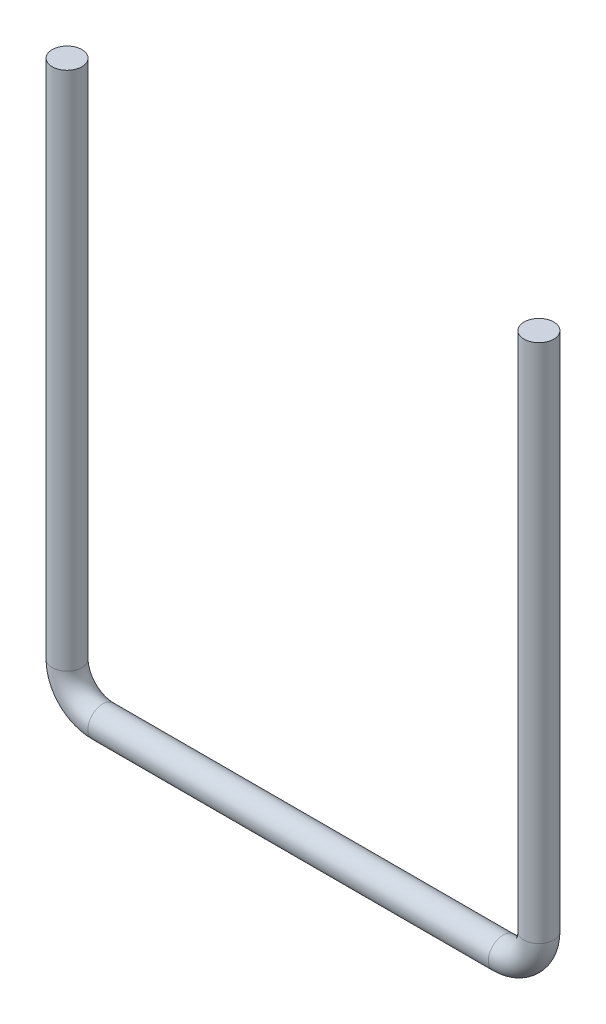
ISO-10303-21;
HEADER;
FILE_DESCRIPTION(('STEP AP214'),'2;1');
FILE_NAME('part.step','',(''),(''),'','','');
FILE_SCHEMA(('AUTOMOTIVE_DESIGN { 1 0 10303 214 1 1 1 1 }'));
ENDSEC;
DATA;
#1=APPLICATION_CONTEXT('core data for automotive mechanical design processes');
#2=APPLICATION_PROTOCOL_DEFINITION('international standard','automotive_design',2000,#1);
#3=PRODUCT_CONTEXT('',#1,'mechanical');
#4=PRODUCT('Part','Part','',(#3));
#5=PRODUCT_RELATED_PRODUCT_CATEGORY('part','',(#4));
#6=PRODUCT_DEFINITION_FORMATION('','',#4);
#7=PRODUCT_DEFINITION_CONTEXT('part definition',#1,'design');
#8=PRODUCT_DEFINITION('design','',#6,#7);
#9=PRODUCT_DEFINITION_SHAPE('','',#8);
#10=(LENGTH_UNIT() NAMED_UNIT(*) SI_UNIT(.MILLI.,.METRE.));
#11=(NAMED_UNIT(*) PLANE_ANGLE_UNIT() SI_UNIT($,.RADIAN.));
#12=(NAMED_UNIT(*) SI_UNIT($,.STERADIAN.) SOLID_ANGLE_UNIT());
#13=UNCERTAINTY_MEASURE_WITH_UNIT(LENGTH_MEASURE(1.E-05),#10,'distance_accuracy_value','');
#14=(GEOMETRIC_REPRESENTATION_CONTEXT(3) GLOBAL_UNCERTAINTY_ASSIGNED_CONTEXT((#13)) GLOBAL_UNIT_ASSIGNED_CONTEXT((#10,
#11,#12)) REPRESENTATION_CONTEXT('',''));
#15=CARTESIAN_POINT('',(0.,0.,0.));
#16=DIRECTION('',(0.,0.,1.));
#17=DIRECTION('',(1.,0.,0.));
#18=AXIS2_PLACEMENT_3D('',#15,#16,#17);
#19=CARTESIAN_POINT('',(0.,0.,0.));
#20=DIRECTION('',(0.,1.,0.));
#21=DIRECTION('',(0.,0.,1.));
#22=AXIS2_PLACEMENT_3D('',#19,#20,#21);
#23=PLANE('',#22);
#24=CARTESIAN_POINT('',(0.,0.,0.));
#25=DIRECTION('',(0.,1.,0.));
#26=DIRECTION('',(0.,0.,1.));
#27=AXIS2_PLACEMENT_3D('',#24,#25,#26);
#28=CIRCLE('',#27,1.04);
#29=CARTESIAN_POINT('',(0.,0.,1.04));
#30=VERTEX_POINT('',#29);
#31=EDGE_CURVE('E70',#30,#30,#28,.T.);
#32=ORIENTED_EDGE('',*,*,#31,.T.);
#33=EDGE_LOOP('',(#32));
#34=FACE_BOUND('',#33,.T.);
#35=ADVANCED_FACE('F43',(#34),#23,.T.);
#36=CARTESIAN_POINT('',(33.,0.,0.));
#37=DIRECTION('',(0.,-1.,0.));
#38=DIRECTION('',(0.,0.,1.));
#39=AXIS2_PLACEMENT_3D('',#36,#37,#38);
#40=PLANE('',#39);
#41=CARTESIAN_POINT('',(33.,0.,0.));
#42=DIRECTION('',(0.,-1.,0.));
#43=DIRECTION('',(0.,0.,1.));
#44=AXIS2_PLACEMENT_3D('',#41,#42,#43);
#45=CIRCLE('',#44,1.04);
#46=CARTESIAN_POINT('',(33.,0.,1.04));
#47=VERTEX_POINT('',#46);
#48=EDGE_CURVE('E10',#47,#47,#45,.T.);
#49=ORIENTED_EDGE('',*,*,#48,.F.);
#50=EDGE_LOOP('',(#49));
#51=FACE_BOUND('',#50,.T.);
#52=ADVANCED_FACE('F79',(#51),#40,.F.);
#53=CARTESIAN_POINT('',(0.,0.,0.));
#54=DIRECTION('',(0.,-1.,0.));
#55=DIRECTION('',(1.,0.,0.));
#56=AXIS2_PLACEMENT_3D('',#53,#54,#55);
#57=CYLINDRICAL_SURFACE('',#56,1.04);
#58=CARTESIAN_POINT('',(0.,-36.4,0.));
#59=DIRECTION('',(0.,1.,0.));
#60=DIRECTION('',(0.,0.,1.));
#61=AXIS2_PLACEMENT_3D('',#58,#59,#60);
#62=CIRCLE('',#61,1.04);
#63=CARTESIAN_POINT('',(-1.04,-36.4,0.));
#64=VERTEX_POINT('',#63);
#65=EDGE_CURVE('E66',#64,#64,#62,.T.);
#66=ORIENTED_EDGE('',*,*,#65,.T.);
#67=EDGE_LOOP('',(#66));
#68=FACE_BOUND('',#67,.T.);
#69=ORIENTED_EDGE('',*,*,#31,.F.);
#70=EDGE_LOOP('',(#69));
#71=FACE_BOUND('',#70,.T.);
#72=ADVANCED_FACE('F76',(#68,#71),#57,.T.);
#73=CARTESIAN_POINT('',(2.5,-36.4,0.));
#74=DIRECTION('',(0.,0.,1.));
#75=DIRECTION('',(1.,0.,0.));
#76=AXIS2_PLACEMENT_3D('',#73,#74,#75);
#77=TOROIDAL_SURFACE('',#76,2.5,1.04);
#78=CARTESIAN_POINT('',(2.5,-38.9,0.));
#79=DIRECTION('',(-1.,0.,0.));
#80=DIRECTION('',(0.,0.,1.));
#81=AXIS2_PLACEMENT_3D('',#78,#79,#80);
#82=CIRCLE('',#81,1.04);
#83=CARTESIAN_POINT('',(2.5,-39.94,0.));
#84=VERTEX_POINT('',#83);
#85=EDGE_CURVE('E60',#84,#84,#82,.T.);
#86=CARTESIAN_POINT('',(2.5,-36.4,0.));
#87=DIRECTION('',(0.,0.,1.));
#88=DIRECTION('',(1.,0.,0.));
#89=AXIS2_PLACEMENT_3D('',#86,#87,#88);
#90=CIRCLE('',#89,3.54);
#91=EDGE_CURVE('',#64,#84,#90,.T.);
#92=ORIENTED_EDGE('',*,*,#65,.F.);
#93=ORIENTED_EDGE('',*,*,#85,.T.);
#94=ORIENTED_EDGE('',*,*,#91,.T.);
#95=ORIENTED_EDGE('',*,*,#91,.F.);
#96=EDGE_LOOP('',(#92,#94,#93,#95));
#97=FACE_BOUND('',#96,.T.);
#98=ADVANCED_FACE('F78',(#97),#77,.T.);
#99=CARTESIAN_POINT('',(2.5,-38.9,0.));
#100=DIRECTION('',(1.,0.,0.));
#101=DIRECTION('',(0.,1.,0.));
#102=AXIS2_PLACEMENT_3D('',#99,#100,#101);
#103=CYLINDRICAL_SURFACE('',#102,1.04);
#104=CARTESIAN_POINT('',(30.5,-38.9,0.));
#105=DIRECTION('',(-1.,0.,0.));
#106=DIRECTION('',(0.,0.,1.));
#107=AXIS2_PLACEMENT_3D('',#104,#105,#106);
#108=CIRCLE('',#107,1.04);
#109=CARTESIAN_POINT('',(30.5,-39.94,0.));
#110=VERTEX_POINT('',#109);
#111=EDGE_CURVE('E55',#110,#110,#108,.T.);
#112=ORIENTED_EDGE('',*,*,#111,.T.);
#113=EDGE_LOOP('',(#112));
#114=FACE_BOUND('',#113,.T.);
#115=ORIENTED_EDGE('',*,*,#85,.F.);
#116=EDGE_LOOP('',(#115));
#117=FACE_BOUND('',#116,.T.);
#118=ADVANCED_FACE('F86',(#114,#117),#103,.T.);
#119=CARTESIAN_POINT('',(30.5,-36.4,0.));
#120=DIRECTION('',(0.,0.,1.));
#121=DIRECTION('',(1.,0.,0.));
#122=AXIS2_PLACEMENT_3D('',#119,#120,#121);
#123=TOROIDAL_SURFACE('',#122,2.5,1.04);
#124=CARTESIAN_POINT('',(33.,-36.4,0.));
#125=DIRECTION('',(0.,-1.,0.));
#126=DIRECTION('',(0.,0.,1.));
#127=AXIS2_PLACEMENT_3D('',#124,#125,#126);
#128=CIRCLE('',#127,1.04);
#129=CARTESIAN_POINT('',(34.04,-36.4,0.));
#130=VERTEX_POINT('',#129);
#131=EDGE_CURVE('E50',#130,#130,#128,.T.);
#132=CARTESIAN_POINT('',(30.5,-36.4,0.));
#133=DIRECTION('',(0.,0.,1.));
#134=DIRECTION('',(1.,0.,0.));
#135=AXIS2_PLACEMENT_3D('',#132,#133,#134);
#136=CIRCLE('',#135,3.54);
#137=EDGE_CURVE('',#110,#130,#136,.T.);
#138=ORIENTED_EDGE('',*,*,#111,.F.);
#139=ORIENTED_EDGE('',*,*,#131,.T.);
#140=ORIENTED_EDGE('',*,*,#137,.T.);
#141=ORIENTED_EDGE('',*,*,#137,.F.);
#142=EDGE_LOOP('',(#138,#140,#139,#141));
#143=FACE_BOUND('',#142,.T.);
#144=ADVANCED_FACE('F92',(#143),#123,.T.);
#145=CARTESIAN_POINT('',(33.,-36.4,0.));
#146=DIRECTION('',(0.,1.,0.));
#147=DIRECTION('',(-1.,0.,0.));
#148=AXIS2_PLACEMENT_3D('',#145,#146,#147);
#149=CYLINDRICAL_SURFACE('',#148,1.04);
#150=ORIENTED_EDGE('',*,*,#48,.T.);
#151=EDGE_LOOP('',(#150));
#152=FACE_BOUND('',#151,.T.);
#153=ORIENTED_EDGE('',*,*,#131,.F.);
#154=EDGE_LOOP('',(#153));
#155=FACE_BOUND('',#154,.T.);
#156=ADVANCED_FACE('F90',(#152,#155),#149,.T.);
#157=CLOSED_SHELL('',(#35,#52,#72,#98,#118,#144,#156));
#158=MANIFOLD_SOLID_BREP('B2',#157);
#159=ADVANCED_BREP_SHAPE_REPRESENTATION('',(#18,#158),#14);
#160=SHAPE_DEFINITION_REPRESENTATION(#9,#159);
ENDSEC;
END-ISO-10303-21;
